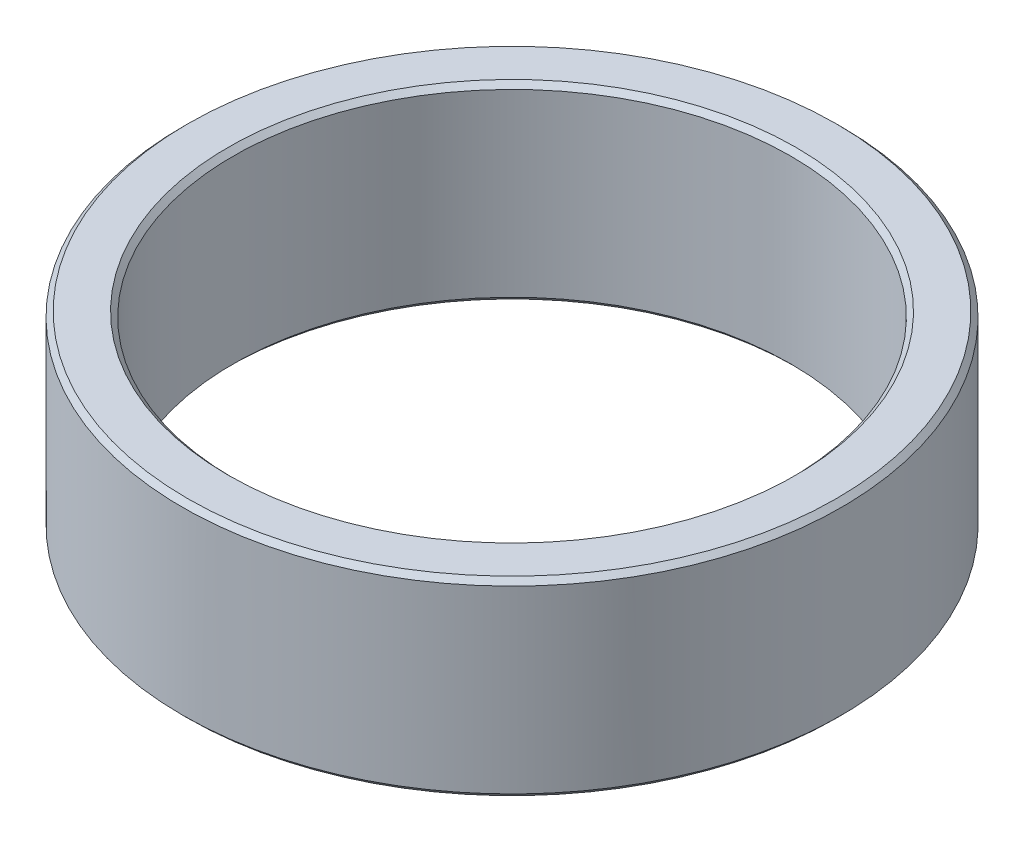
ISO-10303-21;
HEADER;
FILE_DESCRIPTION(('STEP AP214'),'2;1');
FILE_NAME('part.step','',(''),(''),'','','');
FILE_SCHEMA(('AUTOMOTIVE_DESIGN { 1 0 10303 214 1 1 1 1 }'));
ENDSEC;
DATA;
#1=APPLICATION_CONTEXT('core data for automotive mechanical design processes');
#2=APPLICATION_PROTOCOL_DEFINITION('international standard','automotive_design',2000,#1);
#3=PRODUCT_CONTEXT('',#1,'mechanical');
#4=PRODUCT('Part','Part','',(#3));
#5=PRODUCT_RELATED_PRODUCT_CATEGORY('part','',(#4));
#6=PRODUCT_DEFINITION_FORMATION('','',#4);
#7=PRODUCT_DEFINITION_CONTEXT('part definition',#1,'design');
#8=PRODUCT_DEFINITION('design','',#6,#7);
#9=PRODUCT_DEFINITION_SHAPE('','',#8);
#10=(LENGTH_UNIT() NAMED_UNIT(*) SI_UNIT(.MILLI.,.METRE.));
#11=(NAMED_UNIT(*) PLANE_ANGLE_UNIT() SI_UNIT($,.RADIAN.));
#12=(NAMED_UNIT(*) SI_UNIT($,.STERADIAN.) SOLID_ANGLE_UNIT());
#13=UNCERTAINTY_MEASURE_WITH_UNIT(LENGTH_MEASURE(1.E-05),#10,'distance_accuracy_value','');
#14=(GEOMETRIC_REPRESENTATION_CONTEXT(3) GLOBAL_UNCERTAINTY_ASSIGNED_CONTEXT((#13)) GLOBAL_UNIT_ASSIGNED_CONTEXT((#10,
#11,#12)) REPRESENTATION_CONTEXT('',''));
#15=CARTESIAN_POINT('',(0.,0.,0.));
#16=DIRECTION('',(0.,0.,1.));
#17=DIRECTION('',(1.,0.,0.));
#18=AXIS2_PLACEMENT_3D('',#15,#16,#17);
#19=CARTESIAN_POINT('',(0.,7.5,0.));
#20=DIRECTION('',(0.,1.,0.));
#21=DIRECTION('',(0.,0.,1.));
#22=AXIS2_PLACEMENT_3D('',#19,#20,#21);
#23=PLANE('',#22);
#24=CARTESIAN_POINT('',(0.,7.5,0.));
#25=DIRECTION('',(0.,1.,0.));
#26=DIRECTION('',(0.,0.,1.));
#27=AXIS2_PLACEMENT_3D('',#24,#25,#26);
#28=CIRCLE('',#27,11.2);
#29=CARTESIAN_POINT('',(0.,7.5,11.2));
#30=VERTEX_POINT('',#29);
#31=EDGE_CURVE('E10',#30,#30,#28,.F.);
#32=ORIENTED_EDGE('',*,*,#31,.T.);
#33=EDGE_LOOP('',(#32));
#34=FACE_BOUND('',#33,.T.);
#35=CARTESIAN_POINT('',(0.,7.5,0.));
#36=DIRECTION('',(0.,1.,0.));
#37=DIRECTION('',(0.,0.,1.));
#38=AXIS2_PLACEMENT_3D('',#35,#36,#37);
#39=CIRCLE('',#38,12.8);
#40=CARTESIAN_POINT('',(0.,7.5,-12.8));
#41=VERTEX_POINT('',#40);
#42=EDGE_CURVE('E37',#41,#41,#39,.T.);
#43=ORIENTED_EDGE('',*,*,#42,.T.);
#44=EDGE_LOOP('',(#43));
#45=FACE_BOUND('',#44,.T.);
#46=ADVANCED_FACE('F30',(#34,#45),#23,.T.);
#47=CARTESIAN_POINT('',(0.,0.,0.));
#48=DIRECTION('',(0.,1.,0.));
#49=DIRECTION('',(0.,0.,1.));
#50=AXIS2_PLACEMENT_3D('',#47,#48,#49);
#51=PLANE('',#50);
#52=CARTESIAN_POINT('',(0.,0.,0.));
#53=DIRECTION('',(0.,1.,0.));
#54=DIRECTION('',(0.,0.,1.));
#55=AXIS2_PLACEMENT_3D('',#52,#53,#54);
#56=CIRCLE('',#55,11.2);
#57=CARTESIAN_POINT('',(0.,0.,11.2));
#58=VERTEX_POINT('',#57);
#59=EDGE_CURVE('E56',#58,#58,#56,.T.);
#60=ORIENTED_EDGE('',*,*,#59,.T.);
#61=EDGE_LOOP('',(#60));
#62=FACE_BOUND('',#61,.T.);
#63=CARTESIAN_POINT('',(0.,0.,0.));
#64=DIRECTION('',(0.,1.,0.));
#65=DIRECTION('',(0.,0.,1.));
#66=AXIS2_PLACEMENT_3D('',#63,#64,#65);
#67=CIRCLE('',#66,12.8);
#68=CARTESIAN_POINT('',(0.,0.,12.8));
#69=VERTEX_POINT('',#68);
#70=EDGE_CURVE('E59',#69,#69,#67,.F.);
#71=ORIENTED_EDGE('',*,*,#70,.T.);
#72=EDGE_LOOP('',(#71));
#73=FACE_BOUND('',#72,.T.);
#74=ADVANCED_FACE('F63',(#62,#73),#51,.F.);
#75=CARTESIAN_POINT('',(0.,7.5,0.));
#76=DIRECTION('',(0.,-1.,0.));
#77=DIRECTION('',(0.,0.,-1.));
#78=AXIS2_PLACEMENT_3D('',#75,#76,#77);
#79=CYLINDRICAL_SURFACE('',#78,13.);
#80=CARTESIAN_POINT('',(0.,0.200000000000002,0.));
#81=DIRECTION('',(0.,1.,0.));
#82=DIRECTION('',(0.,0.,1.));
#83=AXIS2_PLACEMENT_3D('',#80,#81,#82);
#84=CIRCLE('',#83,13.);
#85=CARTESIAN_POINT('',(0.,0.200000000000002,13.));
#86=VERTEX_POINT('',#85);
#87=EDGE_CURVE('E41',#86,#86,#84,.T.);
#88=ORIENTED_EDGE('',*,*,#87,.T.);
#89=EDGE_LOOP('',(#88));
#90=FACE_BOUND('',#89,.T.);
#91=CARTESIAN_POINT('',(0.,7.30000000000001,0.));
#92=DIRECTION('',(0.,1.,0.));
#93=DIRECTION('',(0.,0.,1.));
#94=AXIS2_PLACEMENT_3D('',#91,#92,#93);
#95=CIRCLE('',#94,13.);
#96=CARTESIAN_POINT('',(0.,7.30000000000001,-13.));
#97=VERTEX_POINT('',#96);
#98=EDGE_CURVE('E45',#97,#97,#95,.F.);
#99=ORIENTED_EDGE('',*,*,#98,.T.);
#100=EDGE_LOOP('',(#99));
#101=FACE_BOUND('',#100,.T.);
#102=ADVANCED_FACE('F73',(#90,#101),#79,.T.);
#103=CARTESIAN_POINT('',(0.,7.5,0.));
#104=DIRECTION('',(0.,-1.,0.));
#105=DIRECTION('',(0.,0.,-1.));
#106=AXIS2_PLACEMENT_3D('',#103,#104,#105);
#107=CYLINDRICAL_SURFACE('',#106,11.);
#108=CARTESIAN_POINT('',(0.,0.199999999999995,0.));
#109=DIRECTION('',(0.,1.,0.));
#110=DIRECTION('',(0.,0.,1.));
#111=AXIS2_PLACEMENT_3D('',#108,#109,#110);
#112=CIRCLE('',#111,11.);
#113=CARTESIAN_POINT('',(0.,0.199999999999995,11.));
#114=VERTEX_POINT('',#113);
#115=EDGE_CURVE('E50',#114,#114,#112,.F.);
#116=ORIENTED_EDGE('',*,*,#115,.T.);
#117=EDGE_LOOP('',(#116));
#118=FACE_BOUND('',#117,.T.);
#119=CARTESIAN_POINT('',(0.,7.30000000000001,0.));
#120=DIRECTION('',(0.,1.,0.));
#121=DIRECTION('',(0.,0.,1.));
#122=AXIS2_PLACEMENT_3D('',#119,#120,#121);
#123=CIRCLE('',#122,11.);
#124=CARTESIAN_POINT('',(0.,7.30000000000001,11.));
#125=VERTEX_POINT('',#124);
#126=EDGE_CURVE('E53',#125,#125,#123,.T.);
#127=ORIENTED_EDGE('',*,*,#126,.T.);
#128=EDGE_LOOP('',(#127));
#129=FACE_BOUND('',#128,.T.);
#130=ADVANCED_FACE('F76',(#118,#129),#107,.F.);
#131=CARTESIAN_POINT('',(0.,0.,0.));
#132=DIRECTION('',(0.,-1.,0.));
#133=DIRECTION('',(0.,0.,-1.));
#134=AXIS2_PLACEMENT_3D('',#131,#132,#133);
#135=CONICAL_SURFACE('',#134,11.2,0.785398163397444);
#136=ORIENTED_EDGE('',*,*,#115,.F.);
#137=EDGE_LOOP('',(#136));
#138=FACE_BOUND('',#137,.T.);
#139=ORIENTED_EDGE('',*,*,#59,.F.);
#140=EDGE_LOOP('',(#139));
#141=FACE_BOUND('',#140,.T.);
#142=ADVANCED_FACE('F69',(#138,#141),#135,.F.);
#143=CARTESIAN_POINT('',(0.,0.200000000000002,0.));
#144=DIRECTION('',(0.,1.,0.));
#145=DIRECTION('',(0.,0.,1.));
#146=AXIS2_PLACEMENT_3D('',#143,#144,#145);
#147=CONICAL_SURFACE('',#146,13.,0.78539816339744);
#148=ORIENTED_EDGE('',*,*,#70,.F.);
#149=EDGE_LOOP('',(#148));
#150=FACE_BOUND('',#149,.T.);
#151=ORIENTED_EDGE('',*,*,#87,.F.);
#152=EDGE_LOOP('',(#151));
#153=FACE_BOUND('',#152,.T.);
#154=ADVANCED_FACE('F65',(#150,#153),#147,.T.);
#155=CARTESIAN_POINT('',(0.,7.30000000000001,0.));
#156=DIRECTION('',(0.,1.,0.));
#157=DIRECTION('',(0.,0.,1.));
#158=AXIS2_PLACEMENT_3D('',#155,#156,#157);
#159=CONICAL_SURFACE('',#158,11.,0.785398163397448);
#160=ORIENTED_EDGE('',*,*,#31,.F.);
#161=EDGE_LOOP('',(#160));
#162=FACE_BOUND('',#161,.T.);
#163=ORIENTED_EDGE('',*,*,#126,.F.);
#164=EDGE_LOOP('',(#163));
#165=FACE_BOUND('',#164,.T.);
#166=ADVANCED_FACE('F68',(#162,#165),#159,.F.);
#167=CARTESIAN_POINT('',(0.,7.5,0.));
#168=DIRECTION('',(0.,-1.,0.));
#169=DIRECTION('',(0.,0.,-1.));
#170=AXIS2_PLACEMENT_3D('',#167,#168,#169);
#171=CONICAL_SURFACE('',#170,12.8,0.785398163397435);
#172=CARTESIAN_POINT('',(0.,7.30000000000001,-13.));
#173=CARTESIAN_POINT('',(0.,7.30208333333334,-12.9979166666667));
#174=CARTESIAN_POINT('',(0.,7.30416666666667,-12.9958333333333));
#175=CARTESIAN_POINT('',(0.,7.30833333333334,-12.9916666666667));
#176=CARTESIAN_POINT('',(0.,7.31041666666667,-12.9895833333333));
#177=CARTESIAN_POINT('',(0.,7.31458333333334,-12.9854166666667));
#178=CARTESIAN_POINT('',(0.,7.31666666666667,-12.9833333333333));
#179=CARTESIAN_POINT('',(0.,7.32083333333334,-12.9791666666667));
#180=CARTESIAN_POINT('',(0.,7.32291666666667,-12.9770833333333));
#181=CARTESIAN_POINT('',(0.,7.32708333333334,-12.9729166666667));
#182=CARTESIAN_POINT('',(0.,7.32916666666667,-12.9708333333333));
#183=CARTESIAN_POINT('',(0.,7.33333333333334,-12.9666666666667));
#184=CARTESIAN_POINT('',(0.,7.33541666666667,-12.9645833333333));
#185=CARTESIAN_POINT('',(0.,7.33958333333334,-12.9604166666667));
#186=CARTESIAN_POINT('',(0.,7.34166666666667,-12.9583333333333));
#187=CARTESIAN_POINT('',(0.,7.34583333333334,-12.9541666666667));
#188=CARTESIAN_POINT('',(0.,7.34791666666667,-12.9520833333333));
#189=CARTESIAN_POINT('',(0.,7.35208333333334,-12.9479166666667));
#190=CARTESIAN_POINT('',(0.,7.35416666666667,-12.9458333333333));
#191=CARTESIAN_POINT('',(0.,7.35833333333334,-12.9416666666667));
#192=CARTESIAN_POINT('',(0.,7.36041666666667,-12.9395833333333));
#193=CARTESIAN_POINT('',(0.,7.36458333333334,-12.9354166666667));
#194=CARTESIAN_POINT('',(0.,7.36666666666667,-12.9333333333333));
#195=CARTESIAN_POINT('',(0.,7.37083333333334,-12.9291666666667));
#196=CARTESIAN_POINT('',(0.,7.37291666666667,-12.9270833333333));
#197=CARTESIAN_POINT('',(0.,7.37708333333334,-12.9229166666667));
#198=CARTESIAN_POINT('',(0.,7.37916666666667,-12.9208333333333));
#199=CARTESIAN_POINT('',(0.,7.38333333333334,-12.9166666666667));
#200=CARTESIAN_POINT('',(0.,7.38541666666667,-12.9145833333333));
#201=CARTESIAN_POINT('',(0.,7.38958333333334,-12.9104166666667));
#202=CARTESIAN_POINT('',(0.,7.39166666666667,-12.9083333333333));
#203=CARTESIAN_POINT('',(0.,7.39583333333334,-12.9041666666667));
#204=CARTESIAN_POINT('',(0.,7.39791666666667,-12.9020833333333));
#205=CARTESIAN_POINT('',(0.,7.40208333333334,-12.8979166666667));
#206=CARTESIAN_POINT('',(0.,7.40416666666667,-12.8958333333333));
#207=CARTESIAN_POINT('',(0.,7.40833333333333,-12.8916666666667));
#208=CARTESIAN_POINT('',(0.,7.41041666666667,-12.8895833333333));
#209=CARTESIAN_POINT('',(0.,7.41458333333334,-12.8854166666667));
#210=CARTESIAN_POINT('',(0.,7.41666666666667,-12.8833333333333));
#211=CARTESIAN_POINT('',(0.,7.42083333333334,-12.8791666666667));
#212=CARTESIAN_POINT('',(0.,7.42291666666667,-12.8770833333333));
#213=CARTESIAN_POINT('',(0.,7.42708333333333,-12.8729166666667));
#214=CARTESIAN_POINT('',(0.,7.42916666666667,-12.8708333333333));
#215=CARTESIAN_POINT('',(0.,7.43333333333333,-12.8666666666667));
#216=CARTESIAN_POINT('',(0.,7.43541666666667,-12.8645833333333));
#217=CARTESIAN_POINT('',(0.,7.43958333333333,-12.8604166666667));
#218=CARTESIAN_POINT('',(0.,7.44166666666667,-12.8583333333333));
#219=CARTESIAN_POINT('',(0.,7.44583333333333,-12.8541666666667));
#220=CARTESIAN_POINT('',(0.,7.44791666666667,-12.8520833333333));
#221=CARTESIAN_POINT('',(0.,7.45208333333333,-12.8479166666667));
#222=CARTESIAN_POINT('',(0.,7.45416666666667,-12.8458333333333));
#223=CARTESIAN_POINT('',(0.,7.45833333333333,-12.8416666666667));
#224=CARTESIAN_POINT('',(0.,7.46041666666667,-12.8395833333333));
#225=CARTESIAN_POINT('',(0.,7.46458333333333,-12.8354166666667));
#226=CARTESIAN_POINT('',(0.,7.46666666666667,-12.8333333333333));
#227=CARTESIAN_POINT('',(0.,7.47083333333333,-12.8291666666667));
#228=CARTESIAN_POINT('',(0.,7.47291666666667,-12.8270833333333));
#229=CARTESIAN_POINT('',(0.,7.47708333333333,-12.8229166666667));
#230=CARTESIAN_POINT('',(0.,7.47916666666667,-12.8208333333333));
#231=CARTESIAN_POINT('',(0.,7.48333333333333,-12.8166666666667));
#232=CARTESIAN_POINT('',(0.,7.48541666666667,-12.8145833333333));
#233=CARTESIAN_POINT('',(0.,7.48958333333333,-12.8104166666667));
#234=CARTESIAN_POINT('',(0.,7.49166666666667,-12.8083333333333));
#235=CARTESIAN_POINT('',(0.,7.49583333333333,-12.8041666666667));
#236=CARTESIAN_POINT('',(0.,7.49791666666667,-12.8020833333333));
#237=CARTESIAN_POINT('',(0.,7.5,-12.8));
#238=B_SPLINE_CURVE_WITH_KNOTS('',3,(#172,#173,#174,#175,#176,#177,#178,#179,#180,#181,#182,
#183,#184,#185,#186,#187,#188,#189,#190,#191,#192,#193,#194,#195,#196,#197,#198,#199,#200,#201,
#202,#203,#204,#205,#206,#207,#208,#209,#210,#211,#212,#213,#214,#215,#216,#217,#218,#219,#220,
#221,#222,#223,#224,#225,#226,#227,#228,#229,#230,#231,#232,#233,#234,#235,#236,#237),
.UNSPECIFIED.,.F.,.F.,(4,2,2,2,2,2,2,2,2,2,2,2,2,2,2,2,2,2,2,2,2,2,2,2,2,2,2,2,2,2,2,2,4),(0.,
0.00883883476483148,0.017677669529663,0.0265165042944938,0.0353553390593253,0.0441941738241574,
0.0530330085889889,0.0618718433538198,0.0707106781186513,0.0795495128834827,0.0883883476483149,
0.0972271824131463,0.106066017177977,0.114904851942809,0.12374368670764,0.132582521472472,
0.141421356237303,0.150260191002135,0.159099025766966,0.167937860531797,0.176776695296628,
0.185615530061461,0.194454364826292,0.203293199591123,0.212132034355954,0.220970869120786,
0.229809703885618,0.238648538650449,0.24748737341528,0.256326208180112,0.265165042944943,
0.274003877709775,0.282842712474607),.UNSPECIFIED.);
#239=EDGE_CURVE('BSEAM32',#97,#41,#238,.T.);
#240=ORIENTED_EDGE('',*,*,#98,.F.);
#241=ORIENTED_EDGE('',*,*,#42,.F.);
#242=ORIENTED_EDGE('',*,*,#239,.T.);
#243=ORIENTED_EDGE('',*,*,#239,.F.);
#244=EDGE_LOOP('',(#240,#242,#241,#243));
#245=FACE_BOUND('',#244,.T.);
#246=ADVANCED_FACE('F32',(#245),#171,.T.);
#247=CLOSED_SHELL('',(#46,#74,#102,#130,#142,#154,#166,#246));
#248=MANIFOLD_SOLID_BREP('B2',#247);
#249=ADVANCED_BREP_SHAPE_REPRESENTATION('',(#18,#248),#14);
#250=SHAPE_DEFINITION_REPRESENTATION(#9,#249);
ENDSEC;
END-ISO-10303-21;
